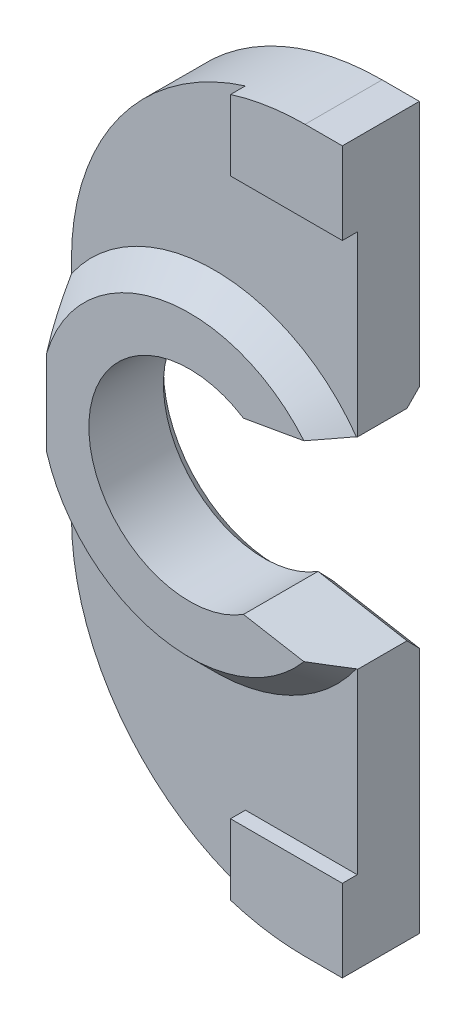
ISO-10303-21;
HEADER;
FILE_DESCRIPTION(('STEP AP214'),'2;1');
FILE_NAME('part.step','',(''),(''),'','','');
FILE_SCHEMA(('AUTOMOTIVE_DESIGN { 1 0 10303 214 1 1 1 1 }'));
ENDSEC;
DATA;
#1=APPLICATION_CONTEXT('core data for automotive mechanical design processes');
#2=APPLICATION_PROTOCOL_DEFINITION('international standard','automotive_design',2000,#1);
#3=PRODUCT_CONTEXT('',#1,'mechanical');
#4=PRODUCT('Part','Part','',(#3));
#5=PRODUCT_RELATED_PRODUCT_CATEGORY('part','',(#4));
#6=PRODUCT_DEFINITION_FORMATION('','',#4);
#7=PRODUCT_DEFINITION_CONTEXT('part definition',#1,'design');
#8=PRODUCT_DEFINITION('design','',#6,#7);
#9=PRODUCT_DEFINITION_SHAPE('','',#8);
#10=(LENGTH_UNIT() NAMED_UNIT(*) SI_UNIT(.MILLI.,.METRE.));
#11=(NAMED_UNIT(*) PLANE_ANGLE_UNIT() SI_UNIT($,.RADIAN.));
#12=(NAMED_UNIT(*) SI_UNIT($,.STERADIAN.) SOLID_ANGLE_UNIT());
#13=UNCERTAINTY_MEASURE_WITH_UNIT(LENGTH_MEASURE(1.E-05),#10,'distance_accuracy_value','');
#14=(GEOMETRIC_REPRESENTATION_CONTEXT(3) GLOBAL_UNCERTAINTY_ASSIGNED_CONTEXT((#13)) GLOBAL_UNIT_ASSIGNED_CONTEXT((#10,
#11,#12)) REPRESENTATION_CONTEXT('',''));
#15=CARTESIAN_POINT('',(0.,0.,0.));
#16=DIRECTION('',(0.,0.,1.));
#17=DIRECTION('',(1.,0.,0.));
#18=AXIS2_PLACEMENT_3D('',#15,#16,#17);
#19=CARTESIAN_POINT('',(0.,0.,2.5));
#20=DIRECTION('',(0.,0.,1.));
#21=DIRECTION('',(1.,0.,0.));
#22=AXIS2_PLACEMENT_3D('',#19,#20,#21);
#23=PLANE('',#22);
#24=DIRECTION('',(-0.984807753012209,0.173648177666924,0.));
#25=VECTOR('',#24,1.);
#26=CARTESIAN_POINT('',(5.75,-4.05,2.5));
#27=LINE('',#26,#25);
#28=CARTESIAN_POINT('',(5.75,-4.05,2.5));
#29=VERTEX_POINT('',#28);
#30=CARTESIAN_POINT('',(5.71392847742438,-4.04363961733469,2.5));
#31=VERTEX_POINT('',#30);
#32=EDGE_CURVE('E284',#29,#31,#27,.T.);
#33=ORIENTED_EDGE('',*,*,#32,.T.);
#34=CARTESIAN_POINT('',(0.,0.,2.5));
#35=DIRECTION('',(0.,0.,1.));
#36=DIRECTION('',(1.,0.,0.));
#37=AXIS2_PLACEMENT_3D('',#34,#35,#36);
#38=CIRCLE('',#37,6.99999999999999);
#39=CARTESIAN_POINT('',(-5.75,-3.99217985566781,2.5));
#40=VERTEX_POINT('',#39);
#41=EDGE_CURVE('E347',#31,#40,#38,.F.);
#42=ORIENTED_EDGE('',*,*,#41,.T.);
#43=DIRECTION('',(0.,-1.,0.));
#44=VECTOR('',#43,1.);
#45=CARTESIAN_POINT('',(-5.75,-4.49999999999993,2.5));
#46=LINE('',#45,#44);
#47=CARTESIAN_POINT('',(-5.75,-4.49999999999993,2.5));
#48=VERTEX_POINT('',#47);
#49=EDGE_CURVE('E302',#40,#48,#46,.T.);
#50=ORIENTED_EDGE('',*,*,#49,.T.);
#51=CARTESIAN_POINT('',(4.25,-4.5,2.5));
#52=DIRECTION('',(0.,0.,1.));
#53=DIRECTION('',(-1.,0.,0.));
#54=AXIS2_PLACEMENT_3D('',#51,#52,#53);
#55=CIRCLE('',#54,10.);
#56=CARTESIAN_POINT('',(1.25,-14.0393920141695,2.5));
#57=VERTEX_POINT('',#56);
#58=EDGE_CURVE('E301',#48,#57,#55,.T.);
#59=ORIENTED_EDGE('',*,*,#58,.T.);
#60=DIRECTION('',(0.,-1.,0.));
#61=VECTOR('',#60,1.);
#62=CARTESIAN_POINT('',(1.25,0.,2.5));
#63=LINE('',#62,#61);
#64=CARTESIAN_POINT('',(1.25,-11.2,2.5));
#65=VERTEX_POINT('',#64);
#66=EDGE_CURVE('E213',#65,#57,#63,.T.);
#67=ORIENTED_EDGE('',*,*,#66,.F.);
#68=DIRECTION('',(-1.,0.,0.));
#69=VECTOR('',#68,1.);
#70=CARTESIAN_POINT('',(0.,-11.2,2.5));
#71=LINE('',#70,#69);
#72=CARTESIAN_POINT('',(5.75,-11.2,2.5));
#73=VERTEX_POINT('',#72);
#74=EDGE_CURVE('E207',#73,#65,#71,.T.);
#75=ORIENTED_EDGE('',*,*,#74,.F.);
#76=DIRECTION('',(0.,1.,0.));
#77=VECTOR('',#76,1.);
#78=CARTESIAN_POINT('',(5.75,-14.5,2.5));
#79=LINE('',#78,#77);
#80=EDGE_CURVE('E282',#73,#29,#79,.T.);
#81=ORIENTED_EDGE('',*,*,#80,.T.);
#82=EDGE_LOOP('',(#33,#42,#50,#59,#67,#75,#81));
#83=FACE_BOUND('',#82,.T.);
#84=ADVANCED_FACE('F38',(#83),#23,.T.);
#85=CARTESIAN_POINT('',(-5.75,4.49999999999993,2.5));
#86=VERTEX_POINT('',#85);
#87=CARTESIAN_POINT('',(-5.75,3.99217985566781,2.5));
#88=VERTEX_POINT('',#87);
#89=EDGE_CURVE('E297',#86,#88,#46,.T.);
#90=ORIENTED_EDGE('',*,*,#89,.T.);
#91=CARTESIAN_POINT('',(0.,0.,2.5));
#92=DIRECTION('',(0.,0.,1.));
#93=DIRECTION('',(1.,0.,0.));
#94=AXIS2_PLACEMENT_3D('',#91,#92,#93);
#95=CIRCLE('',#94,6.99999999999999);
#96=CARTESIAN_POINT('',(5.71392847742438,4.04363961733468,2.5));
#97=VERTEX_POINT('',#96);
#98=EDGE_CURVE('E349',#88,#97,#95,.F.);
#99=ORIENTED_EDGE('',*,*,#98,.T.);
#100=DIRECTION('',(0.984807753012209,0.173648177666923,0.));
#101=VECTOR('',#100,1.);
#102=CARTESIAN_POINT('',(5.75,4.05,2.5));
#103=LINE('',#102,#101);
#104=CARTESIAN_POINT('',(5.75,4.05,2.5));
#105=VERTEX_POINT('',#104);
#106=EDGE_CURVE('E294',#97,#105,#103,.T.);
#107=ORIENTED_EDGE('',*,*,#106,.T.);
#108=DIRECTION('',(0.,1.,0.));
#109=VECTOR('',#108,1.);
#110=CARTESIAN_POINT('',(5.75,4.05,2.5));
#111=LINE('',#110,#109);
#112=CARTESIAN_POINT('',(5.75,11.2,2.5));
#113=VERTEX_POINT('',#112);
#114=EDGE_CURVE('E356',#105,#113,#111,.T.);
#115=ORIENTED_EDGE('',*,*,#114,.T.);
#116=DIRECTION('',(-1.,0.,0.));
#117=VECTOR('',#116,1.);
#118=CARTESIAN_POINT('',(0.,11.2,2.5));
#119=LINE('',#118,#117);
#120=CARTESIAN_POINT('',(1.25,11.2,2.5));
#121=VERTEX_POINT('',#120);
#122=EDGE_CURVE('E240',#113,#121,#119,.T.);
#123=ORIENTED_EDGE('',*,*,#122,.T.);
#124=DIRECTION('',(0.,1.,0.));
#125=VECTOR('',#124,1.);
#126=CARTESIAN_POINT('',(1.25,0.,2.5));
#127=LINE('',#126,#125);
#128=CARTESIAN_POINT('',(1.25,14.0393920141695,2.5));
#129=VERTEX_POINT('',#128);
#130=EDGE_CURVE('E217',#121,#129,#127,.T.);
#131=ORIENTED_EDGE('',*,*,#130,.T.);
#132=CARTESIAN_POINT('',(4.25,4.5,2.5));
#133=DIRECTION('',(0.,0.,1.));
#134=DIRECTION('',(-1.,0.,0.));
#135=AXIS2_PLACEMENT_3D('',#132,#133,#134);
#136=CIRCLE('',#135,10.);
#137=EDGE_CURVE('E307',#129,#86,#136,.T.);
#138=ORIENTED_EDGE('',*,*,#137,.T.);
#139=EDGE_LOOP('',(#90,#99,#107,#115,#123,#131,#138));
#140=FACE_BOUND('',#139,.T.);
#141=ADVANCED_FACE('F414',(#140),#23,.T.);
#142=CARTESIAN_POINT('',(5.75,-14.5,2.5));
#143=DIRECTION('',(-1.,0.,0.));
#144=DIRECTION('',(0.,0.,1.));
#145=AXIS2_PLACEMENT_3D('',#142,#143,#144);
#146=PLANE('',#145);
#147=DIRECTION('',(0.,1.,0.));
#148=VECTOR('',#147,1.);
#149=CARTESIAN_POINT('',(5.75,-14.5,0.));
#150=LINE('',#149,#148);
#151=CARTESIAN_POINT('',(5.75,-14.5,0.));
#152=VERTEX_POINT('',#151);
#153=CARTESIAN_POINT('',(5.75,-4.55771330594289,0.));
#154=VERTEX_POINT('',#153);
#155=EDGE_CURVE('E281',#152,#154,#150,.T.);
#156=ORIENTED_EDGE('',*,*,#155,.T.);
#157=DIRECTION('',(0.,-0.712498293208669,-0.701673843159864));
#158=VECTOR('',#157,1.);
#159=CARTESIAN_POINT('',(5.75,-4.05,0.500000000000009));
#160=LINE('',#159,#158);
#161=CARTESIAN_POINT('',(5.75,-4.05,0.50000000000001));
#162=VERTEX_POINT('',#161);
#163=EDGE_CURVE('E52',#154,#162,#160,.F.);
#164=ORIENTED_EDGE('',*,*,#163,.T.);
#165=DIRECTION('',(0.,0.,-1.));
#166=VECTOR('',#165,1.);
#167=CARTESIAN_POINT('',(5.75,-4.05,2.5));
#168=LINE('',#167,#166);
#169=EDGE_CURVE('E295',#29,#162,#168,.T.);
#170=ORIENTED_EDGE('',*,*,#169,.F.);
#171=ORIENTED_EDGE('',*,*,#80,.F.);
#172=DIRECTION('',(0.,0.,-1.));
#173=VECTOR('',#172,1.);
#174=CARTESIAN_POINT('',(5.75,-11.2,3.1));
#175=LINE('',#174,#173);
#176=CARTESIAN_POINT('',(5.75,-11.2,3.1));
#177=VERTEX_POINT('',#176);
#178=EDGE_CURVE('E218',#177,#73,#175,.T.);
#179=ORIENTED_EDGE('',*,*,#178,.F.);
#180=DIRECTION('',(0.,-1.,0.));
#181=VECTOR('',#180,1.);
#182=CARTESIAN_POINT('',(5.75,0.,3.1));
#183=LINE('',#182,#181);
#184=CARTESIAN_POINT('',(5.75,-14.5,3.1));
#185=VERTEX_POINT('',#184);
#186=EDGE_CURVE('E225',#177,#185,#183,.T.);
#187=ORIENTED_EDGE('',*,*,#186,.T.);
#188=DIRECTION('',(0.,0.,-1.));
#189=VECTOR('',#188,1.);
#190=CARTESIAN_POINT('',(5.75,-14.5,2.5));
#191=LINE('',#190,#189);
#192=EDGE_CURVE('E310',#185,#152,#191,.T.);
#193=ORIENTED_EDGE('',*,*,#192,.T.);
#194=EDGE_LOOP('',(#156,#164,#170,#171,#179,#187,#193));
#195=FACE_BOUND('',#194,.T.);
#196=ADVANCED_FACE('F380',(#195),#146,.F.);
#197=CARTESIAN_POINT('',(5.75,-4.05,2.5));
#198=DIRECTION('',(-0.173648177666924,-0.984807753012209,0.));
#199=DIRECTION('',(0.984807753012209,-0.173648177666924,0.));
#200=AXIS2_PLACEMENT_3D('',#197,#198,#199);
#201=PLANE('',#200);
#202=ORIENTED_EDGE('',*,*,#169,.T.);
#203=DIRECTION('',(-0.984807753012209,0.173648177666924,0.));
#204=VECTOR('',#203,1.);
#205=CARTESIAN_POINT('',(5.75,-4.05,0.500000000000009));
#206=LINE('',#205,#204);
#207=CARTESIAN_POINT('',(2.1710370982712,-3.41893227747058,0.500000000000009));
#208=VERTEX_POINT('',#207);
#209=EDGE_CURVE('E66',#162,#208,#206,.T.);
#210=ORIENTED_EDGE('',*,*,#209,.T.);
#211=DIRECTION('',(0.,0.,-1.));
#212=VECTOR('',#211,1.);
#213=CARTESIAN_POINT('',(2.1710370982712,-3.41893227747058,2.5));
#214=LINE('',#213,#212);
#215=CARTESIAN_POINT('',(2.1710370982712,-3.41893227747058,3.5));
#216=VERTEX_POINT('',#215);
#217=EDGE_CURVE('E343',#216,#208,#214,.T.);
#218=ORIENTED_EDGE('',*,*,#217,.F.);
#219=DIRECTION('',(-0.984807753012209,0.173648177666924,0.));
#220=VECTOR('',#219,1.);
#221=CARTESIAN_POINT('',(-0.519207074993954,-2.94456964503021,3.5));
#222=LINE('',#221,#220);
#223=CARTESIAN_POINT('',(4.60368046815133,-3.84787293802199,3.5));
#224=VERTEX_POINT('',#223);
#225=EDGE_CURVE('E269',#224,#216,#222,.T.);
#226=ORIENTED_EDGE('',*,*,#225,.F.);
#227=CARTESIAN_POINT('',(4.60368046815133,-3.84787293802199,3.5));
#228=CARTESIAN_POINT('',(4.69712587753436,-3.86434988491957,3.41773028763104));
#229=CARTESIAN_POINT('',(4.79030234890888,-3.8807794107901,3.33514654572433));
#230=CARTESIAN_POINT('',(4.97617369042814,-3.91355354324043,3.16942707423543));
#231=CARTESIAN_POINT('',(5.0688685734413,-3.92989815208926,3.08629135953899));
#232=CARTESIAN_POINT('',(5.25383748566177,-3.96251316190602,2.9195400740654));
#233=CARTESIAN_POINT('',(5.34611151732714,-3.97878356330738,2.83592450609737));
#234=CARTESIAN_POINT('',(5.53028787525767,-4.01125882441915,2.66826721503222));
#235=CARTESIAN_POINT('',(5.62219019148347,-4.02746368235936,2.58422548056146));
#236=CARTESIAN_POINT('',(5.71392847742438,-4.04363961733469,2.5));
#237=B_SPLINE_CURVE_WITH_KNOTS('',3,(#227,#228,#229,#230,#231,#232,#233,#234,#235,#236),
.UNSPECIFIED.,.F.,.F.,(4,2,2,2,4),(0.,0.376756384107006,0.753502648679371,1.13024670997776,
1.50700087940601),.UNSPECIFIED.);
#238=EDGE_CURVE('E353',#224,#31,#237,.T.);
#239=ORIENTED_EDGE('',*,*,#238,.T.);
#240=ORIENTED_EDGE('',*,*,#32,.F.);
#241=EDGE_LOOP('',(#202,#210,#218,#226,#239,#240));
#242=FACE_BOUND('',#241,.T.);
#243=ADVANCED_FACE('F370',(#242),#201,.F.);
#244=CARTESIAN_POINT('',(0.,0.,2.5));
#245=DIRECTION('',(0.,0.,-1.));
#246=DIRECTION('',(-1.,0.,0.));
#247=AXIS2_PLACEMENT_3D('',#244,#245,#246);
#248=CYLINDRICAL_SURFACE('',#247,4.05);
#249=ORIENTED_EDGE('',*,*,#217,.T.);
#250=CARTESIAN_POINT('',(0.,0.,0.500000000000009));
#251=DIRECTION('',(0.,0.,1.));
#252=DIRECTION('',(1.,0.,0.));
#253=AXIS2_PLACEMENT_3D('',#250,#251,#252);
#254=CIRCLE('',#253,4.05);
#255=CARTESIAN_POINT('',(2.1710370982712,3.41893227747058,0.500000000000009));
#256=VERTEX_POINT('',#255);
#257=EDGE_CURVE('E11',#208,#256,#254,.F.);
#258=ORIENTED_EDGE('',*,*,#257,.T.);
#259=DIRECTION('',(0.,0.,-1.));
#260=VECTOR('',#259,1.);
#261=CARTESIAN_POINT('',(2.1710370982712,3.41893227747058,2.5));
#262=LINE('',#261,#260);
#263=CARTESIAN_POINT('',(2.1710370982712,3.41893227747058,3.5));
#264=VERTEX_POINT('',#263);
#265=EDGE_CURVE('E341',#264,#256,#262,.T.);
#266=ORIENTED_EDGE('',*,*,#265,.F.);
#267=CARTESIAN_POINT('',(0.,0.,3.5));
#268=DIRECTION('',(0.,0.,1.));
#269=DIRECTION('',(1.,0.,0.));
#270=AXIS2_PLACEMENT_3D('',#267,#268,#269);
#271=CIRCLE('',#270,4.05);
#272=EDGE_CURVE('E272',#216,#264,#271,.F.);
#273=ORIENTED_EDGE('',*,*,#272,.F.);
#274=EDGE_LOOP('',(#249,#258,#266,#273));
#275=FACE_BOUND('',#274,.T.);
#276=ADVANCED_FACE('F406',(#275),#248,.F.);
#277=CARTESIAN_POINT('',(5.75,4.05,2.5));
#278=DIRECTION('',(-0.173648177666923,0.984807753012209,0.));
#279=DIRECTION('',(-0.98480775301221,-0.173648177666923,0.));
#280=AXIS2_PLACEMENT_3D('',#277,#278,#279);
#281=PLANE('',#280);
#282=ORIENTED_EDGE('',*,*,#265,.T.);
#283=DIRECTION('',(0.98480775301221,0.173648177666923,0.));
#284=VECTOR('',#283,1.);
#285=CARTESIAN_POINT('',(5.75,4.05,0.500000000000009));
#286=LINE('',#285,#284);
#287=CARTESIAN_POINT('',(5.75,4.05,0.500000000000009));
#288=VERTEX_POINT('',#287);
#289=EDGE_CURVE('E399',#256,#288,#286,.T.);
#290=ORIENTED_EDGE('',*,*,#289,.T.);
#291=DIRECTION('',(0.,0.,-1.));
#292=VECTOR('',#291,1.);
#293=CARTESIAN_POINT('',(5.75,4.05,2.5));
#294=LINE('',#293,#292);
#295=EDGE_CURVE('E338',#105,#288,#294,.T.);
#296=ORIENTED_EDGE('',*,*,#295,.F.);
#297=ORIENTED_EDGE('',*,*,#106,.F.);
#298=CARTESIAN_POINT('',(5.71392847742438,4.04363961733468,2.5));
#299=CARTESIAN_POINT('',(5.62219019148347,4.02746368235935,2.58422548056145));
#300=CARTESIAN_POINT('',(5.53028787525767,4.01125882441914,2.66826721503222));
#301=CARTESIAN_POINT('',(5.34611151732714,3.97878356330737,2.83592450609737));
#302=CARTESIAN_POINT('',(5.25383748566177,3.96251316190602,2.9195400740654));
#303=CARTESIAN_POINT('',(5.0688685734413,3.92989815208926,3.08629135953899));
#304=CARTESIAN_POINT('',(4.97617369042814,3.91355354324042,3.16942707423543));
#305=CARTESIAN_POINT('',(4.79030234890888,3.8807794107901,3.33514654572433));
#306=CARTESIAN_POINT('',(4.69712587753436,3.86434988491956,3.41773028763105));
#307=CARTESIAN_POINT('',(4.60368046815134,3.84787293802199,3.50000000000001));
#308=B_SPLINE_CURVE_WITH_KNOTS('',3,(#298,#299,#300,#301,#302,#303,#304,#305,#306,#307),
.UNSPECIFIED.,.F.,.F.,(4,2,2,2,4),(0.,0.376754169428249,0.75349823072664,1.130244495299,
1.50700087940601),.UNSPECIFIED.);
#309=CARTESIAN_POINT('',(4.60368046815133,3.84787293802199,3.5));
#310=VERTEX_POINT('',#309);
#311=EDGE_CURVE('E393',#97,#310,#308,.T.);
#312=ORIENTED_EDGE('',*,*,#311,.T.);
#313=DIRECTION('',(0.984807753012209,0.173648177666923,0.));
#314=VECTOR('',#313,1.);
#315=CARTESIAN_POINT('',(-0.519207074993951,2.94456964503021,3.5));
#316=LINE('',#315,#314);
#317=EDGE_CURVE('E275',#264,#310,#316,.T.);
#318=ORIENTED_EDGE('',*,*,#317,.F.);
#319=EDGE_LOOP('',(#282,#290,#296,#297,#312,#318));
#320=FACE_BOUND('',#319,.T.);
#321=ADVANCED_FACE('F401',(#320),#281,.F.);
#322=CARTESIAN_POINT('',(5.75,4.05,2.5));
#323=DIRECTION('',(-1.,0.,0.));
#324=DIRECTION('',(0.,0.,1.));
#325=AXIS2_PLACEMENT_3D('',#322,#323,#324);
#326=PLANE('',#325);
#327=ORIENTED_EDGE('',*,*,#295,.T.);
#328=DIRECTION('',(0.,-0.712498293208669,0.701673843159864));
#329=VECTOR('',#328,1.);
#330=CARTESIAN_POINT('',(5.75,4.05,0.500000000000009));
#331=LINE('',#330,#329);
#332=CARTESIAN_POINT('',(5.75,4.55771330594288,0.));
#333=VERTEX_POINT('',#332);
#334=EDGE_CURVE('E495',#288,#333,#331,.F.);
#335=ORIENTED_EDGE('',*,*,#334,.T.);
#336=DIRECTION('',(0.,1.,0.));
#337=VECTOR('',#336,1.);
#338=CARTESIAN_POINT('',(5.75,4.05,0.));
#339=LINE('',#338,#337);
#340=CARTESIAN_POINT('',(5.75,14.5,0.));
#341=VERTEX_POINT('',#340);
#342=EDGE_CURVE('E312',#333,#341,#339,.T.);
#343=ORIENTED_EDGE('',*,*,#342,.T.);
#344=DIRECTION('',(0.,0.,-1.));
#345=VECTOR('',#344,1.);
#346=CARTESIAN_POINT('',(5.75,14.5,2.5));
#347=LINE('',#346,#345);
#348=CARTESIAN_POINT('',(5.75,14.5,3.1));
#349=VERTEX_POINT('',#348);
#350=EDGE_CURVE('E335',#349,#341,#347,.T.);
#351=ORIENTED_EDGE('',*,*,#350,.F.);
#352=DIRECTION('',(0.,1.,0.));
#353=VECTOR('',#352,1.);
#354=CARTESIAN_POINT('',(5.75,0.,3.1));
#355=LINE('',#354,#353);
#356=CARTESIAN_POINT('',(5.75,11.2,3.1));
#357=VERTEX_POINT('',#356);
#358=EDGE_CURVE('E243',#357,#349,#355,.T.);
#359=ORIENTED_EDGE('',*,*,#358,.F.);
#360=DIRECTION('',(0.,0.,-1.));
#361=VECTOR('',#360,1.);
#362=CARTESIAN_POINT('',(5.75,11.2,3.1));
#363=LINE('',#362,#361);
#364=EDGE_CURVE('E257',#357,#113,#363,.T.);
#365=ORIENTED_EDGE('',*,*,#364,.T.);
#366=ORIENTED_EDGE('',*,*,#114,.F.);
#367=EDGE_LOOP('',(#327,#335,#343,#351,#359,#365,#366));
#368=FACE_BOUND('',#367,.T.);
#369=ADVANCED_FACE('F405',(#368),#326,.F.);
#370=CARTESIAN_POINT('',(5.75,14.5,2.5));
#371=DIRECTION('',(0.,-1.,0.));
#372=DIRECTION('',(0.,0.,-1.));
#373=AXIS2_PLACEMENT_3D('',#370,#371,#372);
#374=PLANE('',#373);
#375=DIRECTION('',(-1.,0.,0.));
#376=VECTOR('',#375,1.);
#377=CARTESIAN_POINT('',(5.75,14.5,0.));
#378=LINE('',#377,#376);
#379=CARTESIAN_POINT('',(4.25000000000007,14.5,0.));
#380=VERTEX_POINT('',#379);
#381=EDGE_CURVE('E314',#341,#380,#378,.T.);
#382=ORIENTED_EDGE('',*,*,#381,.T.);
#383=DIRECTION('',(0.,0.,-1.));
#384=VECTOR('',#383,1.);
#385=CARTESIAN_POINT('',(4.25000000000007,14.5,2.5));
#386=LINE('',#385,#384);
#387=CARTESIAN_POINT('',(4.25000000000007,14.5,3.1));
#388=VERTEX_POINT('',#387);
#389=EDGE_CURVE('E332',#388,#380,#386,.T.);
#390=ORIENTED_EDGE('',*,*,#389,.F.);
#391=DIRECTION('',(-1.,0.,0.));
#392=VECTOR('',#391,1.);
#393=CARTESIAN_POINT('',(0.,14.5,3.1));
#394=LINE('',#393,#392);
#395=EDGE_CURVE('E246',#349,#388,#394,.T.);
#396=ORIENTED_EDGE('',*,*,#395,.F.);
#397=ORIENTED_EDGE('',*,*,#350,.T.);
#398=EDGE_LOOP('',(#382,#390,#396,#397));
#399=FACE_BOUND('',#398,.T.);
#400=ADVANCED_FACE('F441',(#399),#374,.F.);
#401=CARTESIAN_POINT('',(4.25,4.5,2.5));
#402=DIRECTION('',(0.,0.,-1.));
#403=DIRECTION('',(-1.,0.,0.));
#404=AXIS2_PLACEMENT_3D('',#401,#402,#403);
#405=CYLINDRICAL_SURFACE('',#404,10.);
#406=CARTESIAN_POINT('',(4.25,4.5,0.));
#407=DIRECTION('',(0.,0.,1.));
#408=DIRECTION('',(-1.,0.,0.));
#409=AXIS2_PLACEMENT_3D('',#406,#407,#408);
#410=CIRCLE('',#409,10.);
#411=CARTESIAN_POINT('',(-5.75,4.49999999999993,0.));
#412=VERTEX_POINT('',#411);
#413=EDGE_CURVE('E316',#380,#412,#410,.T.);
#414=ORIENTED_EDGE('',*,*,#413,.T.);
#415=DIRECTION('',(0.,0.,-1.));
#416=VECTOR('',#415,1.);
#417=CARTESIAN_POINT('',(-5.75,4.49999999999993,2.5));
#418=LINE('',#417,#416);
#419=EDGE_CURVE('E329',#86,#412,#418,.T.);
#420=ORIENTED_EDGE('',*,*,#419,.F.);
#421=ORIENTED_EDGE('',*,*,#137,.F.);
#422=DIRECTION('',(0.,0.,-1.));
#423=VECTOR('',#422,1.);
#424=CARTESIAN_POINT('',(1.25,14.0393920141695,3.1));
#425=LINE('',#424,#423);
#426=CARTESIAN_POINT('',(1.25,14.0393920141695,3.1));
#427=VERTEX_POINT('',#426);
#428=EDGE_CURVE('E251',#427,#129,#425,.T.);
#429=ORIENTED_EDGE('',*,*,#428,.F.);
#430=CARTESIAN_POINT('',(4.25,4.5,3.1));
#431=DIRECTION('',(0.,0.,1.));
#432=DIRECTION('',(1.,0.,0.));
#433=AXIS2_PLACEMENT_3D('',#430,#431,#432);
#434=CIRCLE('',#433,10.);
#435=EDGE_CURVE('E249',#388,#427,#434,.T.);
#436=ORIENTED_EDGE('',*,*,#435,.F.);
#437=ORIENTED_EDGE('',*,*,#389,.T.);
#438=EDGE_LOOP('',(#414,#420,#421,#429,#436,#437));
#439=FACE_BOUND('',#438,.T.);
#440=ADVANCED_FACE('F437',(#439),#405,.T.);
#441=CARTESIAN_POINT('',(-5.75,-4.49999999999993,2.5));
#442=DIRECTION('',(1.,0.,0.));
#443=DIRECTION('',(0.,0.,-1.));
#444=AXIS2_PLACEMENT_3D('',#441,#442,#443);
#445=PLANE('',#444);
#446=DIRECTION('',(0.,-1.,0.));
#447=VECTOR('',#446,1.);
#448=CARTESIAN_POINT('',(-5.75,-4.49999999999993,0.));
#449=LINE('',#448,#447);
#450=CARTESIAN_POINT('',(-5.75,-4.49999999999993,0.));
#451=VERTEX_POINT('',#450);
#452=EDGE_CURVE('E318',#412,#451,#449,.T.);
#453=ORIENTED_EDGE('',*,*,#452,.T.);
#454=DIRECTION('',(0.,0.,-1.));
#455=VECTOR('',#454,1.);
#456=CARTESIAN_POINT('',(-5.75,-4.49999999999993,2.5));
#457=LINE('',#456,#455);
#458=EDGE_CURVE('E326',#48,#451,#457,.T.);
#459=ORIENTED_EDGE('',*,*,#458,.F.);
#460=ORIENTED_EDGE('',*,*,#49,.F.);
#461=CARTESIAN_POINT('',(-5.75,-3.99217985566781,2.5));
#462=CARTESIAN_POINT('',(-5.75,-3.90180240769152,2.55153953865916));
#463=CARTESIAN_POINT('',(-5.75,-3.8109196800283,2.60219407376041));
#464=CARTESIAN_POINT('',(-5.75,-3.62805900191775,2.70151431766857));
#465=CARTESIAN_POINT('',(-5.75,-3.53608090547775,2.75017975744617));
#466=CARTESIAN_POINT('',(-5.75,-3.25909191578406,2.892494903162));
#467=CARTESIAN_POINT('',(-5.75,-3.07236459984431,2.9828446342258));
#468=CARTESIAN_POINT('',(-5.75,-2.69371263023023,3.1525665038618));
#469=CARTESIAN_POINT('',(-5.75,-2.50178348024446,3.23192875824658));
#470=CARTESIAN_POINT('',(-5.75,-2.11209800499191,3.37703001038166));
#471=CARTESIAN_POINT('',(-5.75,-1.91432336908472,3.4427195088457));
#472=CARTESIAN_POINT('',(-5.75,-1.71391365010027,3.5));
#473=B_SPLINE_CURVE_WITH_KNOTS('',3,(#461,#462,#463,#464,#465,#466,#467,#468,#469,#470,#471,
#472),.UNSPECIFIED.,.F.,.F.,(4,2,2,2,2,4),(0.,0.312114460192861,0.624270995766412,
1.24629527751471,1.86887553778871,2.49367195066354),.UNSPECIFIED.);
#474=CARTESIAN_POINT('',(-5.75,-1.71391365010027,3.5));
#475=VERTEX_POINT('',#474);
#476=EDGE_CURVE('E364',#40,#475,#473,.T.);
#477=ORIENTED_EDGE('',*,*,#476,.T.);
#478=DIRECTION('',(0.,-1.,0.));
#479=VECTOR('',#478,1.);
#480=CARTESIAN_POINT('',(-5.75,0.,3.5));
#481=LINE('',#480,#479);
#482=CARTESIAN_POINT('',(-5.75,1.71391365010027,3.5));
#483=VERTEX_POINT('',#482);
#484=EDGE_CURVE('E263',#483,#475,#481,.T.);
#485=ORIENTED_EDGE('',*,*,#484,.F.);
#486=CARTESIAN_POINT('',(-5.75,1.71391365010027,3.5));
#487=CARTESIAN_POINT('',(-5.75,1.91432336908472,3.4427195088457));
#488=CARTESIAN_POINT('',(-5.75,2.11209800499191,3.37703001038166));
#489=CARTESIAN_POINT('',(-5.75,2.50178348024446,3.23192875824658));
#490=CARTESIAN_POINT('',(-5.75,2.69371263023022,3.1525665038618));
#491=CARTESIAN_POINT('',(-5.75,3.07236459984431,2.9828446342258));
#492=CARTESIAN_POINT('',(-5.75,3.25909191578405,2.89249490316201));
#493=CARTESIAN_POINT('',(-5.75,3.53608090547775,2.75017975744617));
#494=CARTESIAN_POINT('',(-5.75,3.62805900191774,2.70151431766857));
#495=CARTESIAN_POINT('',(-5.75,3.8109196800283,2.60219407376041));
#496=CARTESIAN_POINT('',(-5.75,3.90180240769152,2.55153953865916));
#497=CARTESIAN_POINT('',(-5.75,3.99217985566781,2.5));
#498=B_SPLINE_CURVE_WITH_KNOTS('',3,(#486,#487,#488,#489,#490,#491,#492,#493,#494,#495,#496,
#497),.UNSPECIFIED.,.F.,.F.,(4,2,2,2,2,4),(0.,0.624796412874831,1.24737667314883,
1.86940095489713,2.18155749047067,2.49367195066353),.UNSPECIFIED.);
#499=EDGE_CURVE('E388',#483,#88,#498,.T.);
#500=ORIENTED_EDGE('',*,*,#499,.T.);
#501=ORIENTED_EDGE('',*,*,#89,.F.);
#502=ORIENTED_EDGE('',*,*,#419,.T.);
#503=EDGE_LOOP('',(#453,#459,#460,#477,#485,#500,#501,#502));
#504=FACE_BOUND('',#503,.T.);
#505=ADVANCED_FACE('F433',(#504),#445,.F.);
#506=CARTESIAN_POINT('',(4.25,-4.5,2.5));
#507=DIRECTION('',(0.,0.,-1.));
#508=DIRECTION('',(-1.,0.,0.));
#509=AXIS2_PLACEMENT_3D('',#506,#507,#508);
#510=CYLINDRICAL_SURFACE('',#509,10.);
#511=CARTESIAN_POINT('',(4.25,-4.5,0.));
#512=DIRECTION('',(0.,0.,1.));
#513=DIRECTION('',(-1.,0.,0.));
#514=AXIS2_PLACEMENT_3D('',#511,#512,#513);
#515=CIRCLE('',#514,10.);
#516=CARTESIAN_POINT('',(4.25000000000007,-14.5,0.));
#517=VERTEX_POINT('',#516);
#518=EDGE_CURVE('E320',#451,#517,#515,.T.);
#519=ORIENTED_EDGE('',*,*,#518,.T.);
#520=DIRECTION('',(0.,0.,-1.));
#521=VECTOR('',#520,1.);
#522=CARTESIAN_POINT('',(4.25000000000007,-14.5,2.5));
#523=LINE('',#522,#521);
#524=CARTESIAN_POINT('',(4.25000000000007,-14.5,3.1));
#525=VERTEX_POINT('',#524);
#526=EDGE_CURVE('E222',#525,#517,#523,.T.);
#527=ORIENTED_EDGE('',*,*,#526,.F.);
#528=CARTESIAN_POINT('',(4.25,-4.5,3.1));
#529=DIRECTION('',(0.,0.,-1.));
#530=DIRECTION('',(1.,0.,0.));
#531=AXIS2_PLACEMENT_3D('',#528,#529,#530);
#532=CIRCLE('',#531,10.);
#533=CARTESIAN_POINT('',(1.25,-14.0393920141695,3.1));
#534=VERTEX_POINT('',#533);
#535=EDGE_CURVE('E199',#525,#534,#532,.T.);
#536=ORIENTED_EDGE('',*,*,#535,.T.);
#537=DIRECTION('',(0.,0.,-1.));
#538=VECTOR('',#537,1.);
#539=CARTESIAN_POINT('',(1.25,-14.0393920141695,3.1));
#540=LINE('',#539,#538);
#541=EDGE_CURVE('E210',#534,#57,#540,.T.);
#542=ORIENTED_EDGE('',*,*,#541,.T.);
#543=ORIENTED_EDGE('',*,*,#58,.F.);
#544=ORIENTED_EDGE('',*,*,#458,.T.);
#545=EDGE_LOOP('',(#519,#527,#536,#542,#543,#544));
#546=FACE_BOUND('',#545,.T.);
#547=ADVANCED_FACE('F220',(#546),#510,.T.);
#548=CARTESIAN_POINT('',(5.75,-14.5,2.5));
#549=DIRECTION('',(0.,1.,0.));
#550=DIRECTION('',(0.,0.,1.));
#551=AXIS2_PLACEMENT_3D('',#548,#549,#550);
#552=PLANE('',#551);
#553=DIRECTION('',(1.,0.,0.));
#554=VECTOR('',#553,1.);
#555=CARTESIAN_POINT('',(5.75,-14.5,0.));
#556=LINE('',#555,#554);
#557=EDGE_CURVE('E285',#517,#152,#556,.T.);
#558=ORIENTED_EDGE('',*,*,#557,.T.);
#559=ORIENTED_EDGE('',*,*,#192,.F.);
#560=DIRECTION('',(-1.,0.,0.));
#561=VECTOR('',#560,1.);
#562=CARTESIAN_POINT('',(0.,-14.5,3.1));
#563=LINE('',#562,#561);
#564=EDGE_CURVE('E223',#185,#525,#563,.T.);
#565=ORIENTED_EDGE('',*,*,#564,.T.);
#566=ORIENTED_EDGE('',*,*,#526,.T.);
#567=EDGE_LOOP('',(#558,#559,#565,#566));
#568=FACE_BOUND('',#567,.T.);
#569=ADVANCED_FACE('F427',(#568),#552,.F.);
#570=CARTESIAN_POINT('',(0.,0.,0.));
#571=DIRECTION('',(0.,0.,1.));
#572=DIRECTION('',(1.,0.,0.));
#573=AXIS2_PLACEMENT_3D('',#570,#571,#572);
#574=PLANE('',#573);
#575=ORIENTED_EDGE('',*,*,#342,.F.);
#576=DIRECTION('',(-0.984807753012209,-0.173648177666923,0.));
#577=VECTOR('',#576,1.);
#578=CARTESIAN_POINT('',(-0.606031163827414,3.43697352153633,0.));
#579=LINE('',#578,#577);
#580=CARTESIAN_POINT('',(2.26893948874891,3.94390841632966,0.));
#581=VERTEX_POINT('',#580);
#582=EDGE_CURVE('E500',#333,#581,#579,.T.);
#583=ORIENTED_EDGE('',*,*,#582,.T.);
#584=CARTESIAN_POINT('',(0.,0.,0.));
#585=DIRECTION('',(0.,0.,1.));
#586=DIRECTION('',(1.,0.,0.));
#587=AXIS2_PLACEMENT_3D('',#584,#585,#586);
#588=CIRCLE('',#587,4.55000000000001);
#589=CARTESIAN_POINT('',(2.26893948874891,-3.94390841632966,0.));
#590=VERTEX_POINT('',#589);
#591=EDGE_CURVE('E491',#581,#590,#588,.T.);
#592=ORIENTED_EDGE('',*,*,#591,.T.);
#593=DIRECTION('',(0.984807753012209,-0.173648177666924,0.));
#594=VECTOR('',#593,1.);
#595=CARTESIAN_POINT('',(-0.606031163827418,-3.43697352153632,0.));
#596=LINE('',#595,#594);
#597=EDGE_CURVE('E496',#590,#154,#596,.T.);
#598=ORIENTED_EDGE('',*,*,#597,.T.);
#599=ORIENTED_EDGE('',*,*,#155,.F.);
#600=ORIENTED_EDGE('',*,*,#557,.F.);
#601=ORIENTED_EDGE('',*,*,#518,.F.);
#602=ORIENTED_EDGE('',*,*,#452,.F.);
#603=ORIENTED_EDGE('',*,*,#413,.F.);
#604=ORIENTED_EDGE('',*,*,#381,.F.);
#605=EDGE_LOOP('',(#575,#583,#592,#598,#599,#600,#601,#602,#603,#604));
#606=FACE_BOUND('',#605,.T.);
#607=ADVANCED_FACE('F424',(#606),#574,.F.);
#608=CARTESIAN_POINT('',(0.,0.,3.5));
#609=DIRECTION('',(0.,0.,1.));
#610=DIRECTION('',(1.,0.,0.));
#611=AXIS2_PLACEMENT_3D('',#608,#609,#610);
#612=PLANE('',#611);
#613=ORIENTED_EDGE('',*,*,#484,.T.);
#614=CARTESIAN_POINT('',(0.,0.,3.5));
#615=DIRECTION('',(0.,0.,1.));
#616=DIRECTION('',(1.,0.,0.));
#617=AXIS2_PLACEMENT_3D('',#614,#615,#616);
#618=CIRCLE('',#617,6.);
#619=EDGE_CURVE('E266',#475,#224,#618,.T.);
#620=ORIENTED_EDGE('',*,*,#619,.T.);
#621=ORIENTED_EDGE('',*,*,#225,.T.);
#622=ORIENTED_EDGE('',*,*,#272,.T.);
#623=ORIENTED_EDGE('',*,*,#317,.T.);
#624=CARTESIAN_POINT('',(0.,0.,3.5));
#625=DIRECTION('',(0.,0.,1.));
#626=DIRECTION('',(1.,0.,0.));
#627=AXIS2_PLACEMENT_3D('',#624,#625,#626);
#628=CIRCLE('',#627,6.);
#629=EDGE_CURVE('E278',#310,#483,#628,.T.);
#630=ORIENTED_EDGE('',*,*,#629,.T.);
#631=EDGE_LOOP('',(#613,#620,#621,#622,#623,#630));
#632=FACE_BOUND('',#631,.T.);
#633=ADVANCED_FACE('F422',(#632),#612,.T.);
#634=CARTESIAN_POINT('',(1.25,0.,3.1));
#635=DIRECTION('',(-1.,0.,0.));
#636=DIRECTION('',(0.,0.,1.));
#637=AXIS2_PLACEMENT_3D('',#634,#635,#636);
#638=PLANE('',#637);
#639=ORIENTED_EDGE('',*,*,#130,.F.);
#640=DIRECTION('',(0.,0.,-1.));
#641=VECTOR('',#640,1.);
#642=CARTESIAN_POINT('',(1.25,11.2,3.1));
#643=LINE('',#642,#641);
#644=CARTESIAN_POINT('',(1.25,11.2,3.1));
#645=VERTEX_POINT('',#644);
#646=EDGE_CURVE('E260',#645,#121,#643,.T.);
#647=ORIENTED_EDGE('',*,*,#646,.F.);
#648=DIRECTION('',(0.,1.,0.));
#649=VECTOR('',#648,1.);
#650=CARTESIAN_POINT('',(1.25,0.,3.1));
#651=LINE('',#650,#649);
#652=EDGE_CURVE('E236',#645,#427,#651,.T.);
#653=ORIENTED_EDGE('',*,*,#652,.T.);
#654=ORIENTED_EDGE('',*,*,#428,.T.);
#655=EDGE_LOOP('',(#639,#647,#653,#654));
#656=FACE_BOUND('',#655,.T.);
#657=ADVANCED_FACE('F474',(#656),#638,.T.);
#658=CARTESIAN_POINT('',(0.,11.2,3.1));
#659=DIRECTION('',(0.,-1.,0.));
#660=DIRECTION('',(1.,0.,0.));
#661=AXIS2_PLACEMENT_3D('',#658,#659,#660);
#662=PLANE('',#661);
#663=ORIENTED_EDGE('',*,*,#122,.F.);
#664=ORIENTED_EDGE('',*,*,#364,.F.);
#665=DIRECTION('',(-1.,0.,0.));
#666=VECTOR('',#665,1.);
#667=CARTESIAN_POINT('',(0.,11.2,3.1));
#668=LINE('',#667,#666);
#669=EDGE_CURVE('E239',#357,#645,#668,.T.);
#670=ORIENTED_EDGE('',*,*,#669,.T.);
#671=ORIENTED_EDGE('',*,*,#646,.T.);
#672=EDGE_LOOP('',(#663,#664,#670,#671));
#673=FACE_BOUND('',#672,.T.);
#674=ADVANCED_FACE('F470',(#673),#662,.T.);
#675=CARTESIAN_POINT('',(0.,0.,3.1));
#676=DIRECTION('',(0.,0.,1.));
#677=DIRECTION('',(1.,0.,0.));
#678=AXIS2_PLACEMENT_3D('',#675,#676,#677);
#679=PLANE('',#678);
#680=ORIENTED_EDGE('',*,*,#652,.F.);
#681=ORIENTED_EDGE('',*,*,#669,.F.);
#682=ORIENTED_EDGE('',*,*,#358,.T.);
#683=ORIENTED_EDGE('',*,*,#395,.T.);
#684=ORIENTED_EDGE('',*,*,#435,.T.);
#685=EDGE_LOOP('',(#680,#681,#682,#683,#684));
#686=FACE_BOUND('',#685,.T.);
#687=ADVANCED_FACE('F530',(#686),#679,.T.);
#688=CARTESIAN_POINT('',(1.25,0.,3.1));
#689=DIRECTION('',(1.,0.,0.));
#690=DIRECTION('',(0.,0.,-1.));
#691=AXIS2_PLACEMENT_3D('',#688,#689,#690);
#692=PLANE('',#691);
#693=ORIENTED_EDGE('',*,*,#66,.T.);
#694=ORIENTED_EDGE('',*,*,#541,.F.);
#695=DIRECTION('',(0.,-1.,0.));
#696=VECTOR('',#695,1.);
#697=CARTESIAN_POINT('',(1.25,0.,3.1));
#698=LINE('',#697,#696);
#699=CARTESIAN_POINT('',(1.25,-11.2,3.1));
#700=VERTEX_POINT('',#699);
#701=EDGE_CURVE('E194',#700,#534,#698,.T.);
#702=ORIENTED_EDGE('',*,*,#701,.F.);
#703=DIRECTION('',(0.,0.,-1.));
#704=VECTOR('',#703,1.);
#705=CARTESIAN_POINT('',(1.25,-11.2,3.1));
#706=LINE('',#705,#704);
#707=EDGE_CURVE('E231',#700,#65,#706,.T.);
#708=ORIENTED_EDGE('',*,*,#707,.T.);
#709=EDGE_LOOP('',(#693,#694,#702,#708));
#710=FACE_BOUND('',#709,.T.);
#711=ADVANCED_FACE('F211',(#710),#692,.F.);
#712=CARTESIAN_POINT('',(0.,-11.2,3.1));
#713=DIRECTION('',(0.,-1.,0.));
#714=DIRECTION('',(1.,0.,0.));
#715=AXIS2_PLACEMENT_3D('',#712,#713,#714);
#716=PLANE('',#715);
#717=ORIENTED_EDGE('',*,*,#74,.T.);
#718=ORIENTED_EDGE('',*,*,#707,.F.);
#719=DIRECTION('',(-1.,0.,0.));
#720=VECTOR('',#719,1.);
#721=CARTESIAN_POINT('',(0.,-11.2,3.1));
#722=LINE('',#721,#720);
#723=EDGE_CURVE('E203',#177,#700,#722,.T.);
#724=ORIENTED_EDGE('',*,*,#723,.F.);
#725=ORIENTED_EDGE('',*,*,#178,.T.);
#726=EDGE_LOOP('',(#717,#718,#724,#725));
#727=FACE_BOUND('',#726,.T.);
#728=ADVANCED_FACE('F521',(#727),#716,.F.);
#729=CARTESIAN_POINT('',(0.,0.,3.1));
#730=DIRECTION('',(0.,0.,1.));
#731=DIRECTION('',(1.,0.,0.));
#732=AXIS2_PLACEMENT_3D('',#729,#730,#731);
#733=PLANE('',#732);
#734=ORIENTED_EDGE('',*,*,#701,.T.);
#735=ORIENTED_EDGE('',*,*,#535,.F.);
#736=ORIENTED_EDGE('',*,*,#564,.F.);
#737=ORIENTED_EDGE('',*,*,#186,.F.);
#738=ORIENTED_EDGE('',*,*,#723,.T.);
#739=EDGE_LOOP('',(#734,#735,#736,#737,#738));
#740=FACE_BOUND('',#739,.T.);
#741=ADVANCED_FACE('F196',(#740),#733,.T.);
#742=CARTESIAN_POINT('',(0.,0.,3.5));
#743=DIRECTION('',(0.,0.,-1.));
#744=DIRECTION('',(-1.,0.,0.));
#745=AXIS2_PLACEMENT_3D('',#742,#743,#744);
#746=CONICAL_SURFACE('',#745,6.,0.785398163397443);
#747=ORIENTED_EDGE('',*,*,#476,.F.);
#748=ORIENTED_EDGE('',*,*,#41,.F.);
#749=ORIENTED_EDGE('',*,*,#238,.F.);
#750=ORIENTED_EDGE('',*,*,#619,.F.);
#751=EDGE_LOOP('',(#747,#748,#749,#750));
#752=FACE_BOUND('',#751,.T.);
#753=ADVANCED_FACE('F374',(#752),#746,.T.);
#754=CARTESIAN_POINT('',(0.,0.,3.5));
#755=DIRECTION('',(0.,0.,-1.));
#756=DIRECTION('',(-1.,0.,0.));
#757=AXIS2_PLACEMENT_3D('',#754,#755,#756);
#758=CONICAL_SURFACE('',#757,6.,0.785398163397442);
#759=ORIENTED_EDGE('',*,*,#311,.F.);
#760=ORIENTED_EDGE('',*,*,#98,.F.);
#761=ORIENTED_EDGE('',*,*,#499,.F.);
#762=ORIENTED_EDGE('',*,*,#629,.F.);
#763=EDGE_LOOP('',(#759,#760,#761,#762));
#764=FACE_BOUND('',#763,.T.);
#765=ADVANCED_FACE('F378',(#764),#758,.T.);
#766=CARTESIAN_POINT('',(5.75,-4.05,0.500000000000009));
#767=DIRECTION('',(-0.122787803968968,-0.69636424032002,0.707106781186547));
#768=DIRECTION('',(-0.984807753012209,0.173648177666924,0.));
#769=AXIS2_PLACEMENT_3D('',#766,#767,#768);
#770=PLANE('',#769);
#771=ORIENTED_EDGE('',*,*,#163,.F.);
#772=ORIENTED_EDGE('',*,*,#597,.F.);
#773=CARTESIAN_POINT('',(2.1710370982712,-3.41893227747058,0.500000000000009));
#774=CARTESIAN_POINT('',(2.18834027522415,-3.50641764903344,0.416848392955479));
#775=CARTESIAN_POINT('',(2.20515040378052,-3.59390838942338,0.333605881692844));
#776=CARTESIAN_POINT('',(2.23778453200039,-3.76890043573118,0.166939214668578));
#777=CARTESIAN_POINT('',(2.25360853360378,-3.85640174162792,0.0835150592646073));
#778=CARTESIAN_POINT('',(2.26893948875048,-3.94390841633062,1.93678165526019E-13));
#779=B_SPLINE_CURVE_WITH_KNOTS('',3,(#773,#774,#775,#776,#777,#778),.UNSPECIFIED.,.F.,.F.,(4,2,
4),(0.,0.365785089658321,0.731569459727899),.UNSPECIFIED.);
#780=EDGE_CURVE('E43',#208,#590,#779,.T.);
#781=ORIENTED_EDGE('',*,*,#780,.F.);
#782=ORIENTED_EDGE('',*,*,#209,.F.);
#783=EDGE_LOOP('',(#771,#772,#781,#782));
#784=FACE_BOUND('',#783,.T.);
#785=ADVANCED_FACE('F40',(#784),#770,.F.);
#786=CARTESIAN_POINT('',(0.,0.,0.500000000000009));
#787=DIRECTION('',(0.,0.,-1.));
#788=DIRECTION('',(-1.,0.,0.));
#789=AXIS2_PLACEMENT_3D('',#786,#787,#788);
#790=CONICAL_SURFACE('',#789,4.05,0.785398163397448);
#791=ORIENTED_EDGE('',*,*,#780,.T.);
#792=ORIENTED_EDGE('',*,*,#591,.F.);
#793=CARTESIAN_POINT('',(2.26893948874947,3.94390841633063,0.));
#794=CARTESIAN_POINT('',(2.25360853360293,3.85640174162794,0.0835150592644406));
#795=CARTESIAN_POINT('',(2.23778453199987,3.7689004357312,0.166939214668473));
#796=CARTESIAN_POINT('',(2.20515040378104,3.59390838942339,0.333605881692929));
#797=CARTESIAN_POINT('',(2.18834027522537,3.50641764903344,0.416848392955691));
#798=CARTESIAN_POINT('',(2.1710370982733,3.41893227747057,0.500000000000384));
#799=B_SPLINE_CURVE_WITH_KNOTS('',3,(#793,#794,#795,#796,#797,#798),.UNSPECIFIED.,.F.,.F.,(4,2,
4),(0.,0.365784370069578,0.731569459727887),.UNSPECIFIED.);
#800=EDGE_CURVE('E489',#256,#581,#799,.F.);
#801=ORIENTED_EDGE('',*,*,#800,.F.);
#802=ORIENTED_EDGE('',*,*,#257,.F.);
#803=EDGE_LOOP('',(#791,#792,#801,#802));
#804=FACE_BOUND('',#803,.T.);
#805=ADVANCED_FACE('F385',(#804),#790,.F.);
#806=CARTESIAN_POINT('',(5.75,4.05,0.500000000000009));
#807=DIRECTION('',(-0.122787803968967,0.69636424032002,0.707106781186547));
#808=DIRECTION('',(0.98480775301221,0.173648177666923,0.));
#809=AXIS2_PLACEMENT_3D('',#806,#807,#808);
#810=PLANE('',#809);
#811=ORIENTED_EDGE('',*,*,#800,.T.);
#812=ORIENTED_EDGE('',*,*,#582,.F.);
#813=ORIENTED_EDGE('',*,*,#334,.F.);
#814=ORIENTED_EDGE('',*,*,#289,.F.);
#815=EDGE_LOOP('',(#811,#812,#813,#814));
#816=FACE_BOUND('',#815,.T.);
#817=ADVANCED_FACE('F494',(#816),#810,.F.);
#818=CLOSED_SHELL('',(#84,#141,#196,#243,#276,#321,#369,#400,#440,#505,#547,#569,#607,#633,#657,
#674,#687,#711,#728,#741,#753,#765,#785,#805,#817));
#819=MANIFOLD_SOLID_BREP('B2',#818);
#820=ADVANCED_BREP_SHAPE_REPRESENTATION('',(#18,#819),#14);
#821=SHAPE_DEFINITION_REPRESENTATION(#9,#820);
ENDSEC;
END-ISO-10303-21;
